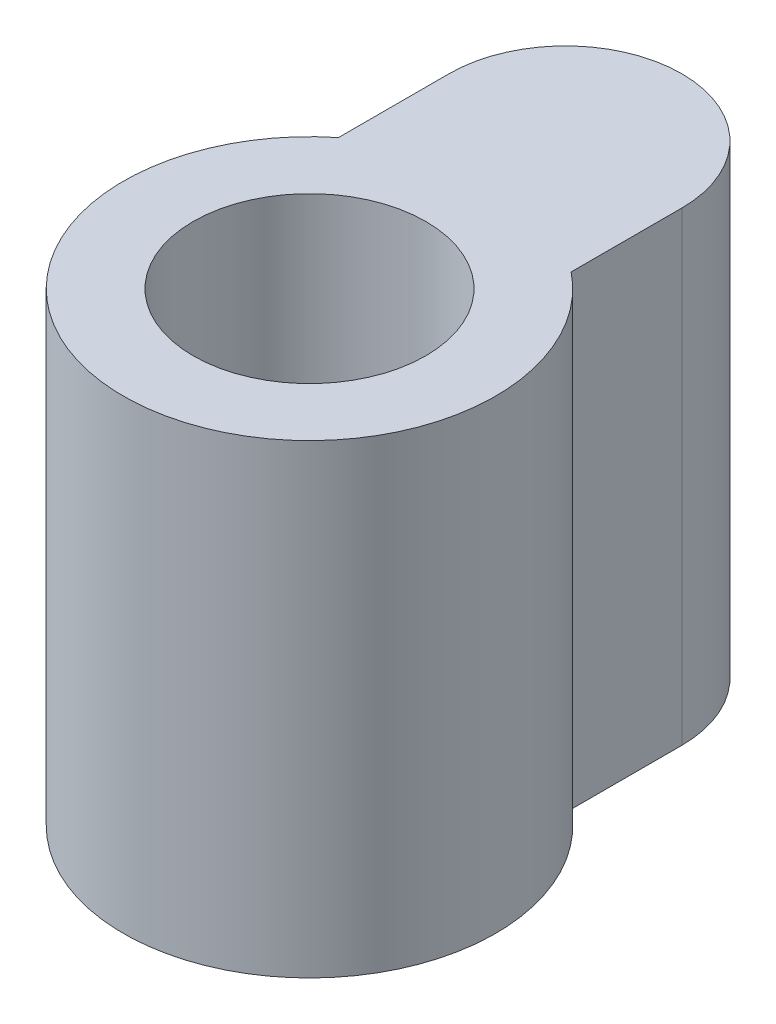
ISO-10303-21;
HEADER;
FILE_DESCRIPTION(('STEP AP214'),'2;1');
FILE_NAME('part.step','',(''),(''),'','','');
FILE_SCHEMA(('AUTOMOTIVE_DESIGN { 1 0 10303 214 1 1 1 1 }'));
ENDSEC;
DATA;
#1=APPLICATION_CONTEXT('core data for automotive mechanical design processes');
#2=APPLICATION_PROTOCOL_DEFINITION('international standard','automotive_design',2000,#1);
#3=PRODUCT_CONTEXT('',#1,'mechanical');
#4=PRODUCT('Part','Part','',(#3));
#5=PRODUCT_RELATED_PRODUCT_CATEGORY('part','',(#4));
#6=PRODUCT_DEFINITION_FORMATION('','',#4);
#7=PRODUCT_DEFINITION_CONTEXT('part definition',#1,'design');
#8=PRODUCT_DEFINITION('design','',#6,#7);
#9=PRODUCT_DEFINITION_SHAPE('','',#8);
#10=(LENGTH_UNIT() NAMED_UNIT(*) SI_UNIT(.MILLI.,.METRE.));
#11=(NAMED_UNIT(*) PLANE_ANGLE_UNIT() SI_UNIT($,.RADIAN.));
#12=(NAMED_UNIT(*) SI_UNIT($,.STERADIAN.) SOLID_ANGLE_UNIT());
#13=UNCERTAINTY_MEASURE_WITH_UNIT(LENGTH_MEASURE(1.E-05),#10,'distance_accuracy_value','');
#14=(GEOMETRIC_REPRESENTATION_CONTEXT(3) GLOBAL_UNCERTAINTY_ASSIGNED_CONTEXT((#13)) GLOBAL_UNIT_ASSIGNED_CONTEXT((#10,
#11,#12)) REPRESENTATION_CONTEXT('',''));
#15=CARTESIAN_POINT('',(0.,0.,0.));
#16=DIRECTION('',(0.,0.,1.));
#17=DIRECTION('',(1.,0.,0.));
#18=AXIS2_PLACEMENT_3D('',#15,#16,#17);
#19=CARTESIAN_POINT('',(0.,10.,-5.5));
#20=DIRECTION('',(0.,-1.,0.));
#21=DIRECTION('',(0.,0.,-1.));
#22=AXIS2_PLACEMENT_3D('',#19,#20,#21);
#23=CYLINDRICAL_SURFACE('',#22,2.5);
#24=DIRECTION('',(0.,-1.,0.));
#25=VECTOR('',#24,1.);
#26=CARTESIAN_POINT('',(-2.5,10.,-5.5));
#27=LINE('',#26,#25);
#28=CARTESIAN_POINT('',(-2.5,10.,-5.5));
#29=VERTEX_POINT('',#28);
#30=CARTESIAN_POINT('',(-2.5,0.,-5.5));
#31=VERTEX_POINT('',#30);
#32=EDGE_CURVE('E97',#29,#31,#27,.T.);
#33=ORIENTED_EDGE('',*,*,#32,.F.);
#34=CARTESIAN_POINT('',(0.,10.,-5.5));
#35=DIRECTION('',(0.,1.,0.));
#36=DIRECTION('',(0.,0.,1.));
#37=AXIS2_PLACEMENT_3D('',#34,#35,#36);
#38=CIRCLE('',#37,2.5);
#39=CARTESIAN_POINT('',(2.5,10.,-5.5));
#40=VERTEX_POINT('',#39);
#41=EDGE_CURVE('E43',#40,#29,#38,.T.);
#42=ORIENTED_EDGE('',*,*,#41,.F.);
#43=DIRECTION('',(0.,-1.,0.));
#44=VECTOR('',#43,1.);
#45=CARTESIAN_POINT('',(2.5,10.,-5.5));
#46=LINE('',#45,#44);
#47=CARTESIAN_POINT('',(2.5,0.,-5.5));
#48=VERTEX_POINT('',#47);
#49=EDGE_CURVE('E99',#48,#40,#46,.F.);
#50=ORIENTED_EDGE('',*,*,#49,.F.);
#51=CARTESIAN_POINT('',(0.,0.,-5.5));
#52=DIRECTION('',(0.,1.,0.));
#53=DIRECTION('',(0.,0.,1.));
#54=AXIS2_PLACEMENT_3D('',#51,#52,#53);
#55=CIRCLE('',#54,2.5);
#56=EDGE_CURVE('E11',#31,#48,#55,.F.);
#57=ORIENTED_EDGE('',*,*,#56,.F.);
#58=EDGE_LOOP('',(#33,#42,#50,#57));
#59=FACE_BOUND('',#58,.T.);
#60=ADVANCED_FACE('F35',(#59),#23,.T.);
#61=CARTESIAN_POINT('',(0.,10.,0.));
#62=DIRECTION('',(0.,1.,0.));
#63=DIRECTION('',(0.,0.,1.));
#64=AXIS2_PLACEMENT_3D('',#61,#62,#63);
#65=PLANE('',#64);
#66=DIRECTION('',(0.,0.,-1.));
#67=VECTOR('',#66,1.);
#68=CARTESIAN_POINT('',(2.5,10.,-8.));
#69=LINE('',#68,#67);
#70=CARTESIAN_POINT('',(2.5,10.,-3.1224989991992));
#71=VERTEX_POINT('',#70);
#72=EDGE_CURVE('E92',#71,#40,#69,.T.);
#73=ORIENTED_EDGE('',*,*,#72,.T.);
#74=ORIENTED_EDGE('',*,*,#41,.T.);
#75=DIRECTION('',(0.,0.,1.));
#76=VECTOR('',#75,1.);
#77=CARTESIAN_POINT('',(-2.5,10.,-8.));
#78=LINE('',#77,#76);
#79=CARTESIAN_POINT('',(-2.5,10.,-3.1224989991992));
#80=VERTEX_POINT('',#79);
#81=EDGE_CURVE('E73',#29,#80,#78,.T.);
#82=ORIENTED_EDGE('',*,*,#81,.T.);
#83=CARTESIAN_POINT('',(0.,10.,0.));
#84=DIRECTION('',(0.,1.,0.));
#85=DIRECTION('',(0.,0.,1.));
#86=AXIS2_PLACEMENT_3D('',#83,#84,#85);
#87=CIRCLE('',#86,4.);
#88=EDGE_CURVE('E78',#80,#71,#87,.T.);
#89=ORIENTED_EDGE('',*,*,#88,.T.);
#90=EDGE_LOOP('',(#73,#74,#82,#89));
#91=FACE_BOUND('',#90,.T.);
#92=CARTESIAN_POINT('',(0.,10.,0.));
#93=DIRECTION('',(0.,1.,0.));
#94=DIRECTION('',(0.,0.,1.));
#95=AXIS2_PLACEMENT_3D('',#92,#93,#94);
#96=CIRCLE('',#95,2.5);
#97=CARTESIAN_POINT('',(0.,10.,2.5));
#98=VERTEX_POINT('',#97);
#99=EDGE_CURVE('E111',#98,#98,#96,.T.);
#100=ORIENTED_EDGE('',*,*,#99,.F.);
#101=EDGE_LOOP('',(#100));
#102=FACE_BOUND('',#101,.T.);
#103=ADVANCED_FACE('F76',(#91,#102),#65,.T.);
#104=CARTESIAN_POINT('',(0.,0.,0.));
#105=DIRECTION('',(0.,1.,0.));
#106=DIRECTION('',(0.,0.,1.));
#107=AXIS2_PLACEMENT_3D('',#104,#105,#106);
#108=PLANE('',#107);
#109=DIRECTION('',(0.,0.,1.));
#110=VECTOR('',#109,1.);
#111=CARTESIAN_POINT('',(-2.5,0.,-8.));
#112=LINE('',#111,#110);
#113=CARTESIAN_POINT('',(-2.5,0.,-3.1224989991992));
#114=VERTEX_POINT('',#113);
#115=EDGE_CURVE('E95',#31,#114,#112,.T.);
#116=ORIENTED_EDGE('',*,*,#115,.F.);
#117=ORIENTED_EDGE('',*,*,#56,.T.);
#118=DIRECTION('',(0.,0.,-1.));
#119=VECTOR('',#118,1.);
#120=CARTESIAN_POINT('',(2.5,0.,-8.));
#121=LINE('',#120,#119);
#122=CARTESIAN_POINT('',(2.5,0.,-3.1224989991992));
#123=VERTEX_POINT('',#122);
#124=EDGE_CURVE('E83',#123,#48,#121,.T.);
#125=ORIENTED_EDGE('',*,*,#124,.F.);
#126=CARTESIAN_POINT('',(0.,0.,0.));
#127=DIRECTION('',(0.,1.,0.));
#128=DIRECTION('',(0.,0.,1.));
#129=AXIS2_PLACEMENT_3D('',#126,#127,#128);
#130=CIRCLE('',#129,4.);
#131=EDGE_CURVE('E110',#114,#123,#130,.T.);
#132=ORIENTED_EDGE('',*,*,#131,.F.);
#133=EDGE_LOOP('',(#116,#117,#125,#132));
#134=FACE_BOUND('',#133,.T.);
#135=CARTESIAN_POINT('',(0.,0.,0.));
#136=DIRECTION('',(0.,1.,0.));
#137=DIRECTION('',(0.,0.,1.));
#138=AXIS2_PLACEMENT_3D('',#135,#136,#137);
#139=CIRCLE('',#138,2.5);
#140=CARTESIAN_POINT('',(0.,0.,2.5));
#141=VERTEX_POINT('',#140);
#142=EDGE_CURVE('E118',#141,#141,#139,.T.);
#143=ORIENTED_EDGE('',*,*,#142,.T.);
#144=EDGE_LOOP('',(#143));
#145=FACE_BOUND('',#144,.T.);
#146=ADVANCED_FACE('F112',(#134,#145),#108,.F.);
#147=CARTESIAN_POINT('',(-2.5,10.,-8.));
#148=DIRECTION('',(1.,0.,0.));
#149=DIRECTION('',(0.,0.,-1.));
#150=AXIS2_PLACEMENT_3D('',#147,#148,#149);
#151=PLANE('',#150);
#152=ORIENTED_EDGE('',*,*,#81,.F.);
#153=ORIENTED_EDGE('',*,*,#32,.T.);
#154=ORIENTED_EDGE('',*,*,#115,.T.);
#155=DIRECTION('',(0.,-1.,0.));
#156=VECTOR('',#155,1.);
#157=CARTESIAN_POINT('',(-2.5,10.,-3.1224989991992));
#158=LINE('',#157,#156);
#159=EDGE_CURVE('E88',#80,#114,#158,.T.);
#160=ORIENTED_EDGE('',*,*,#159,.F.);
#161=EDGE_LOOP('',(#152,#153,#154,#160));
#162=FACE_BOUND('',#161,.T.);
#163=ADVANCED_FACE('F94',(#162),#151,.F.);
#164=CARTESIAN_POINT('',(0.,10.,0.));
#165=DIRECTION('',(0.,-1.,0.));
#166=DIRECTION('',(0.,0.,-1.));
#167=AXIS2_PLACEMENT_3D('',#164,#165,#166);
#168=CYLINDRICAL_SURFACE('',#167,4.);
#169=ORIENTED_EDGE('',*,*,#131,.T.);
#170=DIRECTION('',(0.,-1.,0.));
#171=VECTOR('',#170,1.);
#172=CARTESIAN_POINT('',(2.5,10.,-3.1224989991992));
#173=LINE('',#172,#171);
#174=EDGE_CURVE('E90',#71,#123,#173,.T.);
#175=ORIENTED_EDGE('',*,*,#174,.F.);
#176=ORIENTED_EDGE('',*,*,#88,.F.);
#177=ORIENTED_EDGE('',*,*,#159,.T.);
#178=EDGE_LOOP('',(#169,#175,#176,#177));
#179=FACE_BOUND('',#178,.T.);
#180=ADVANCED_FACE('F87',(#179),#168,.T.);
#181=CARTESIAN_POINT('',(2.5,10.,-8.));
#182=DIRECTION('',(-1.,0.,0.));
#183=DIRECTION('',(0.,0.,1.));
#184=AXIS2_PLACEMENT_3D('',#181,#182,#183);
#185=PLANE('',#184);
#186=ORIENTED_EDGE('',*,*,#124,.T.);
#187=ORIENTED_EDGE('',*,*,#49,.T.);
#188=ORIENTED_EDGE('',*,*,#72,.F.);
#189=ORIENTED_EDGE('',*,*,#174,.T.);
#190=EDGE_LOOP('',(#186,#187,#188,#189));
#191=FACE_BOUND('',#190,.T.);
#192=ADVANCED_FACE('F106',(#191),#185,.F.);
#193=CARTESIAN_POINT('',(0.,10.,0.));
#194=DIRECTION('',(0.,-1.,0.));
#195=DIRECTION('',(0.,0.,-1.));
#196=AXIS2_PLACEMENT_3D('',#193,#194,#195);
#197=CYLINDRICAL_SURFACE('',#196,2.5);
#198=ORIENTED_EDGE('',*,*,#99,.T.);
#199=EDGE_LOOP('',(#198));
#200=FACE_BOUND('',#199,.T.);
#201=ORIENTED_EDGE('',*,*,#142,.F.);
#202=EDGE_LOOP('',(#201));
#203=FACE_BOUND('',#202,.T.);
#204=ADVANCED_FACE('F125',(#200,#203),#197,.F.);
#205=CLOSED_SHELL('',(#60,#103,#146,#163,#180,#192,#204));
#206=MANIFOLD_SOLID_BREP('B2',#205);
#207=ADVANCED_BREP_SHAPE_REPRESENTATION('',(#18,#206),#14);
#208=SHAPE_DEFINITION_REPRESENTATION(#9,#207);
ENDSEC;
END-ISO-10303-21;
